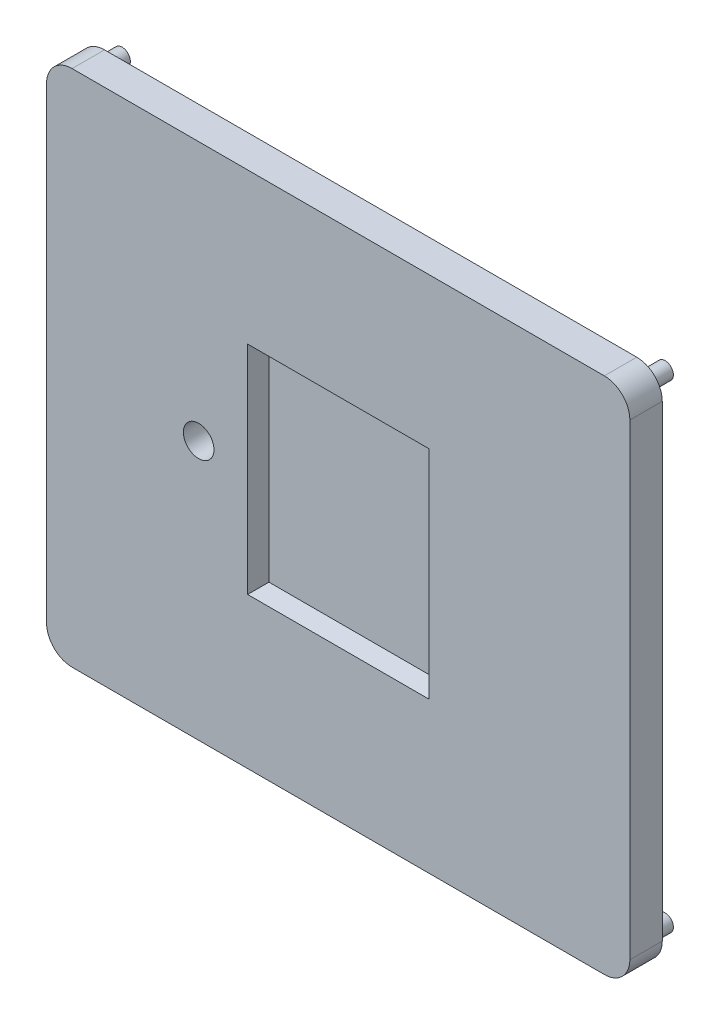
ISO-10303-21;
HEADER;
FILE_DESCRIPTION(('STEP AP214'),'2;1');
FILE_NAME('part.step','',(''),(''),'','','');
FILE_SCHEMA(('AUTOMOTIVE_DESIGN { 1 0 10303 214 1 1 1 1 }'));
ENDSEC;
DATA;
#1=APPLICATION_CONTEXT('core data for automotive mechanical design processes');
#2=APPLICATION_PROTOCOL_DEFINITION('international standard','automotive_design',2000,#1);
#3=PRODUCT_CONTEXT('',#1,'mechanical');
#4=PRODUCT('Part','Part','',(#3));
#5=PRODUCT_RELATED_PRODUCT_CATEGORY('part','',(#4));
#6=PRODUCT_DEFINITION_FORMATION('','',#4);
#7=PRODUCT_DEFINITION_CONTEXT('part definition',#1,'design');
#8=PRODUCT_DEFINITION('design','',#6,#7);
#9=PRODUCT_DEFINITION_SHAPE('','',#8);
#10=(LENGTH_UNIT() NAMED_UNIT(*) SI_UNIT(.MILLI.,.METRE.));
#11=(NAMED_UNIT(*) PLANE_ANGLE_UNIT() SI_UNIT($,.RADIAN.));
#12=(NAMED_UNIT(*) SI_UNIT($,.STERADIAN.) SOLID_ANGLE_UNIT());
#13=UNCERTAINTY_MEASURE_WITH_UNIT(LENGTH_MEASURE(1.E-05),#10,'distance_accuracy_value','');
#14=(GEOMETRIC_REPRESENTATION_CONTEXT(3) GLOBAL_UNCERTAINTY_ASSIGNED_CONTEXT((#13)) GLOBAL_UNIT_ASSIGNED_CONTEXT((#10,
#11,#12)) REPRESENTATION_CONTEXT('',''));
#15=CARTESIAN_POINT('',(0.,0.,0.));
#16=DIRECTION('',(0.,0.,1.));
#17=DIRECTION('',(1.,0.,0.));
#18=AXIS2_PLACEMENT_3D('',#15,#16,#17);
#19=CARTESIAN_POINT('',(-148.169682961673,72.4468468468469,12.7));
#20=DIRECTION('',(0.,0.,-1.));
#21=DIRECTION('',(-1.,0.,0.));
#22=AXIS2_PLACEMENT_3D('',#19,#20,#21);
#23=CYLINDRICAL_SURFACE('',#22,10.);
#24=CARTESIAN_POINT('',(-148.169682961673,72.4468468468469,0.));
#25=DIRECTION('',(0.,0.,1.));
#26=DIRECTION('',(1.,0.,0.));
#27=AXIS2_PLACEMENT_3D('',#24,#25,#26);
#28=CIRCLE('',#27,10.);
#29=CARTESIAN_POINT('',(-148.169682961673,82.4468468468469,0.));
#30=VERTEX_POINT('',#29);
#31=CARTESIAN_POINT('',(-158.169682961673,72.4468468468468,0.));
#32=VERTEX_POINT('',#31);
#33=EDGE_CURVE('E222',#30,#32,#28,.T.);
#34=ORIENTED_EDGE('',*,*,#33,.T.);
#35=DIRECTION('',(0.,0.,-1.));
#36=VECTOR('',#35,1.);
#37=CARTESIAN_POINT('',(-158.169682961673,72.4468468468468,12.7));
#38=LINE('',#37,#36);
#39=CARTESIAN_POINT('',(-158.169682961673,72.4468468468468,12.7));
#40=VERTEX_POINT('',#39);
#41=EDGE_CURVE('E12',#40,#32,#38,.T.);
#42=ORIENTED_EDGE('',*,*,#41,.F.);
#43=CARTESIAN_POINT('',(-148.169682961673,72.4468468468469,12.7));
#44=DIRECTION('',(0.,0.,1.));
#45=DIRECTION('',(1.,0.,0.));
#46=AXIS2_PLACEMENT_3D('',#43,#44,#45);
#47=CIRCLE('',#46,10.);
#48=CARTESIAN_POINT('',(-148.169682961673,82.4468468468469,12.7));
#49=VERTEX_POINT('',#48);
#50=EDGE_CURVE('E209',#49,#40,#47,.T.);
#51=ORIENTED_EDGE('',*,*,#50,.F.);
#52=DIRECTION('',(0.,0.,-1.));
#53=VECTOR('',#52,1.);
#54=CARTESIAN_POINT('',(-148.169682961673,82.4468468468469,12.7));
#55=LINE('',#54,#53);
#56=EDGE_CURVE('E203',#49,#30,#55,.T.);
#57=ORIENTED_EDGE('',*,*,#56,.T.);
#58=EDGE_LOOP('',(#34,#42,#51,#57));
#59=FACE_BOUND('',#58,.T.);
#60=ADVANCED_FACE('F45',(#59),#23,.T.);
#61=CARTESIAN_POINT('',(-158.169682961673,72.4468468468468,12.7));
#62=DIRECTION('',(1.,0.,0.));
#63=DIRECTION('',(0.,0.,-1.));
#64=AXIS2_PLACEMENT_3D('',#61,#62,#63);
#65=PLANE('',#64);
#66=DIRECTION('',(0.,-1.,0.));
#67=VECTOR('',#66,1.);
#68=CARTESIAN_POINT('',(-158.169682961673,72.4468468468468,0.));
#69=LINE('',#68,#67);
#70=CARTESIAN_POINT('',(-158.169682961673,-110.753153153153,0.));
#71=VERTEX_POINT('',#70);
#72=EDGE_CURVE('E220',#32,#71,#69,.T.);
#73=ORIENTED_EDGE('',*,*,#72,.T.);
#74=DIRECTION('',(0.,0.,-1.));
#75=VECTOR('',#74,1.);
#76=CARTESIAN_POINT('',(-158.169682961673,-110.753153153153,12.7));
#77=LINE('',#76,#75);
#78=CARTESIAN_POINT('',(-158.169682961673,-110.753153153153,12.7));
#79=VERTEX_POINT('',#78);
#80=EDGE_CURVE('E53',#79,#71,#77,.T.);
#81=ORIENTED_EDGE('',*,*,#80,.F.);
#82=DIRECTION('',(0.,-1.,0.));
#83=VECTOR('',#82,1.);
#84=CARTESIAN_POINT('',(-158.169682961673,72.4468468468468,12.7));
#85=LINE('',#84,#83);
#86=EDGE_CURVE('E237',#40,#79,#85,.T.);
#87=ORIENTED_EDGE('',*,*,#86,.F.);
#88=ORIENTED_EDGE('',*,*,#41,.T.);
#89=EDGE_LOOP('',(#73,#81,#87,#88));
#90=FACE_BOUND('',#89,.T.);
#91=ADVANCED_FACE('F396',(#90),#65,.F.);
#92=CARTESIAN_POINT('',(-148.169682961673,-110.753153153153,12.7));
#93=DIRECTION('',(0.,0.,-1.));
#94=DIRECTION('',(-1.,0.,0.));
#95=AXIS2_PLACEMENT_3D('',#92,#93,#94);
#96=CYLINDRICAL_SURFACE('',#95,10.);
#97=CARTESIAN_POINT('',(-148.169682961673,-110.753153153153,0.));
#98=DIRECTION('',(0.,0.,1.));
#99=DIRECTION('',(1.,0.,0.));
#100=AXIS2_PLACEMENT_3D('',#97,#98,#99);
#101=CIRCLE('',#100,10.);
#102=CARTESIAN_POINT('',(-148.169682961673,-120.753153153153,0.));
#103=VERTEX_POINT('',#102);
#104=EDGE_CURVE('E218',#71,#103,#101,.T.);
#105=ORIENTED_EDGE('',*,*,#104,.T.);
#106=DIRECTION('',(0.,0.,-1.));
#107=VECTOR('',#106,1.);
#108=CARTESIAN_POINT('',(-148.169682961673,-120.753153153153,12.7));
#109=LINE('',#108,#107);
#110=CARTESIAN_POINT('',(-148.169682961673,-120.753153153153,12.7));
#111=VERTEX_POINT('',#110);
#112=EDGE_CURVE('E188',#111,#103,#109,.T.);
#113=ORIENTED_EDGE('',*,*,#112,.F.);
#114=CARTESIAN_POINT('',(-148.169682961673,-110.753153153153,12.7));
#115=DIRECTION('',(0.,0.,1.));
#116=DIRECTION('',(1.,0.,0.));
#117=AXIS2_PLACEMENT_3D('',#114,#115,#116);
#118=CIRCLE('',#117,10.);
#119=EDGE_CURVE('E235',#79,#111,#118,.T.);
#120=ORIENTED_EDGE('',*,*,#119,.F.);
#121=ORIENTED_EDGE('',*,*,#80,.T.);
#122=EDGE_LOOP('',(#105,#113,#120,#121));
#123=FACE_BOUND('',#122,.T.);
#124=ADVANCED_FACE('F401',(#123),#96,.T.);
#125=CARTESIAN_POINT('',(-148.169682961673,-120.753153153153,12.7));
#126=DIRECTION('',(0.,1.,0.));
#127=DIRECTION('',(0.,0.,1.));
#128=AXIS2_PLACEMENT_3D('',#125,#126,#127);
#129=PLANE('',#128);
#130=DIRECTION('',(1.,0.,0.));
#131=VECTOR('',#130,1.);
#132=CARTESIAN_POINT('',(-148.169682961673,-120.753153153153,0.));
#133=LINE('',#132,#131);
#134=CARTESIAN_POINT('',(60.4303170383271,-120.753153153153,0.));
#135=VERTEX_POINT('',#134);
#136=EDGE_CURVE('E216',#103,#135,#133,.T.);
#137=ORIENTED_EDGE('',*,*,#136,.T.);
#138=DIRECTION('',(0.,0.,-1.));
#139=VECTOR('',#138,1.);
#140=CARTESIAN_POINT('',(60.4303170383271,-120.753153153153,12.7));
#141=LINE('',#140,#139);
#142=CARTESIAN_POINT('',(60.4303170383271,-120.753153153153,12.7));
#143=VERTEX_POINT('',#142);
#144=EDGE_CURVE('E191',#143,#135,#141,.T.);
#145=ORIENTED_EDGE('',*,*,#144,.F.);
#146=DIRECTION('',(1.,0.,0.));
#147=VECTOR('',#146,1.);
#148=CARTESIAN_POINT('',(-148.169682961673,-120.753153153153,12.7));
#149=LINE('',#148,#147);
#150=EDGE_CURVE('E233',#111,#143,#149,.T.);
#151=ORIENTED_EDGE('',*,*,#150,.F.);
#152=ORIENTED_EDGE('',*,*,#112,.T.);
#153=EDGE_LOOP('',(#137,#145,#151,#152));
#154=FACE_BOUND('',#153,.T.);
#155=ADVANCED_FACE('F434',(#154),#129,.F.);
#156=CARTESIAN_POINT('',(60.4303170383271,-110.753153153153,12.7));
#157=DIRECTION('',(0.,0.,-1.));
#158=DIRECTION('',(-1.,0.,0.));
#159=AXIS2_PLACEMENT_3D('',#156,#157,#158);
#160=CYLINDRICAL_SURFACE('',#159,9.99999999999999);
#161=CARTESIAN_POINT('',(60.4303170383271,-110.753153153153,0.));
#162=DIRECTION('',(0.,0.,1.));
#163=DIRECTION('',(1.,0.,0.));
#164=AXIS2_PLACEMENT_3D('',#161,#162,#163);
#165=CIRCLE('',#164,9.99999999999999);
#166=CARTESIAN_POINT('',(70.4303170383271,-110.753153153153,0.));
#167=VERTEX_POINT('',#166);
#168=EDGE_CURVE('E214',#135,#167,#165,.T.);
#169=ORIENTED_EDGE('',*,*,#168,.T.);
#170=DIRECTION('',(0.,0.,-1.));
#171=VECTOR('',#170,1.);
#172=CARTESIAN_POINT('',(70.4303170383271,-110.753153153153,12.7));
#173=LINE('',#172,#171);
#174=CARTESIAN_POINT('',(70.4303170383271,-110.753153153153,12.7));
#175=VERTEX_POINT('',#174);
#176=EDGE_CURVE('E194',#175,#167,#173,.T.);
#177=ORIENTED_EDGE('',*,*,#176,.F.);
#178=CARTESIAN_POINT('',(60.4303170383271,-110.753153153153,12.7));
#179=DIRECTION('',(0.,0.,1.));
#180=DIRECTION('',(1.,0.,0.));
#181=AXIS2_PLACEMENT_3D('',#178,#179,#180);
#182=CIRCLE('',#181,9.99999999999999);
#183=EDGE_CURVE('E231',#143,#175,#182,.T.);
#184=ORIENTED_EDGE('',*,*,#183,.F.);
#185=ORIENTED_EDGE('',*,*,#144,.T.);
#186=EDGE_LOOP('',(#169,#177,#184,#185));
#187=FACE_BOUND('',#186,.T.);
#188=ADVANCED_FACE('F430',(#187),#160,.T.);
#189=CARTESIAN_POINT('',(70.4303170383271,72.4468468468469,12.7));
#190=DIRECTION('',(-1.,0.,0.));
#191=DIRECTION('',(0.,-1.,0.));
#192=AXIS2_PLACEMENT_3D('',#189,#190,#191);
#193=PLANE('',#192);
#194=DIRECTION('',(0.,1.,0.));
#195=VECTOR('',#194,1.);
#196=CARTESIAN_POINT('',(70.4303170383271,72.4468468468469,0.));
#197=LINE('',#196,#195);
#198=CARTESIAN_POINT('',(70.4303170383271,72.4468468468469,0.));
#199=VERTEX_POINT('',#198);
#200=EDGE_CURVE('E212',#167,#199,#197,.T.);
#201=ORIENTED_EDGE('',*,*,#200,.T.);
#202=DIRECTION('',(0.,0.,-1.));
#203=VECTOR('',#202,1.);
#204=CARTESIAN_POINT('',(70.4303170383271,72.4468468468469,12.7));
#205=LINE('',#204,#203);
#206=CARTESIAN_POINT('',(70.4303170383271,72.4468468468469,12.7));
#207=VERTEX_POINT('',#206);
#208=EDGE_CURVE('E197',#207,#199,#205,.T.);
#209=ORIENTED_EDGE('',*,*,#208,.F.);
#210=DIRECTION('',(0.,1.,0.));
#211=VECTOR('',#210,1.);
#212=CARTESIAN_POINT('',(70.4303170383271,72.4468468468469,12.7));
#213=LINE('',#212,#211);
#214=EDGE_CURVE('E229',#175,#207,#213,.T.);
#215=ORIENTED_EDGE('',*,*,#214,.F.);
#216=ORIENTED_EDGE('',*,*,#176,.T.);
#217=EDGE_LOOP('',(#201,#209,#215,#216));
#218=FACE_BOUND('',#217,.T.);
#219=ADVANCED_FACE('F425',(#218),#193,.F.);
#220=CARTESIAN_POINT('',(60.4303170383271,72.4468468468469,12.7));
#221=DIRECTION('',(0.,0.,-1.));
#222=DIRECTION('',(-1.,0.,0.));
#223=AXIS2_PLACEMENT_3D('',#220,#221,#222);
#224=CYLINDRICAL_SURFACE('',#223,9.99999999999999);
#225=CARTESIAN_POINT('',(60.4303170383271,72.4468468468469,0.));
#226=DIRECTION('',(0.,0.,1.));
#227=DIRECTION('',(-1.,0.,0.));
#228=AXIS2_PLACEMENT_3D('',#225,#226,#227);
#229=CIRCLE('',#228,9.99999999999999);
#230=CARTESIAN_POINT('',(60.4303170383271,82.4468468468468,0.));
#231=VERTEX_POINT('',#230);
#232=EDGE_CURVE('E210',#199,#231,#229,.T.);
#233=ORIENTED_EDGE('',*,*,#232,.T.);
#234=DIRECTION('',(0.,0.,-1.));
#235=VECTOR('',#234,1.);
#236=CARTESIAN_POINT('',(60.4303170383271,82.4468468468468,12.7));
#237=LINE('',#236,#235);
#238=CARTESIAN_POINT('',(60.4303170383271,82.4468468468468,12.7));
#239=VERTEX_POINT('',#238);
#240=EDGE_CURVE('E200',#239,#231,#237,.T.);
#241=ORIENTED_EDGE('',*,*,#240,.F.);
#242=CARTESIAN_POINT('',(60.4303170383271,72.4468468468469,12.7));
#243=DIRECTION('',(0.,0.,1.));
#244=DIRECTION('',(-1.,0.,0.));
#245=AXIS2_PLACEMENT_3D('',#242,#243,#244);
#246=CIRCLE('',#245,9.99999999999999);
#247=EDGE_CURVE('E227',#207,#239,#246,.T.);
#248=ORIENTED_EDGE('',*,*,#247,.F.);
#249=ORIENTED_EDGE('',*,*,#208,.T.);
#250=EDGE_LOOP('',(#233,#241,#248,#249));
#251=FACE_BOUND('',#250,.T.);
#252=ADVANCED_FACE('F420',(#251),#224,.T.);
#253=CARTESIAN_POINT('',(-148.169682961673,82.4468468468469,12.7));
#254=DIRECTION('',(0.,-1.,0.));
#255=DIRECTION('',(1.,0.,0.));
#256=AXIS2_PLACEMENT_3D('',#253,#254,#255);
#257=PLANE('',#256);
#258=DIRECTION('',(-1.,0.,0.));
#259=VECTOR('',#258,1.);
#260=CARTESIAN_POINT('',(-148.169682961673,82.4468468468469,0.));
#261=LINE('',#260,#259);
#262=EDGE_CURVE('E207',#231,#30,#261,.T.);
#263=ORIENTED_EDGE('',*,*,#262,.T.);
#264=ORIENTED_EDGE('',*,*,#56,.F.);
#265=DIRECTION('',(-1.,0.,0.));
#266=VECTOR('',#265,1.);
#267=CARTESIAN_POINT('',(-148.169682961673,82.4468468468469,12.7));
#268=LINE('',#267,#266);
#269=EDGE_CURVE('E206',#239,#49,#268,.T.);
#270=ORIENTED_EDGE('',*,*,#269,.F.);
#271=ORIENTED_EDGE('',*,*,#240,.T.);
#272=EDGE_LOOP('',(#263,#264,#270,#271));
#273=FACE_BOUND('',#272,.T.);
#274=ADVANCED_FACE('F418',(#273),#257,.F.);
#275=CARTESIAN_POINT('',(-148.169682961673,72.4468468468469,12.7));
#276=DIRECTION('',(0.,0.,1.));
#277=DIRECTION('',(1.,0.,0.));
#278=AXIS2_PLACEMENT_3D('',#275,#276,#277);
#279=PLANE('',#278);
#280=CARTESIAN_POINT('',(-98.5666408145533,-19.1531531531531,12.7));
#281=DIRECTION('',(0.,0.,1.));
#282=DIRECTION('',(1.,0.,0.));
#283=AXIS2_PLACEMENT_3D('',#280,#281,#282);
#284=CIRCLE('',#283,6.);
#285=CARTESIAN_POINT('',(-92.5666408145533,-19.1531531531531,12.7));
#286=VERTEX_POINT('',#285);
#287=EDGE_CURVE('E380',#286,#286,#284,.T.);
#288=ORIENTED_EDGE('',*,*,#287,.F.);
#289=EDGE_LOOP('',(#288));
#290=FACE_BOUND('',#289,.T.);
#291=DIRECTION('',(-1.,0.,0.));
#292=VECTOR('',#291,1.);
#293=CARTESIAN_POINT('',(-8.36968296167288,23.3468468468469,12.7));
#294=LINE('',#293,#292);
#295=CARTESIAN_POINT('',(-8.36968296167288,23.3468468468469,12.7));
#296=VERTEX_POINT('',#295);
#297=CARTESIAN_POINT('',(-79.3696829616729,23.3468468468469,12.7));
#298=VERTEX_POINT('',#297);
#299=EDGE_CURVE('E151',#296,#298,#294,.T.);
#300=ORIENTED_EDGE('',*,*,#299,.F.);
#301=DIRECTION('',(0.,1.,0.));
#302=VECTOR('',#301,1.);
#303=CARTESIAN_POINT('',(-8.36968296167288,23.3468468468469,12.7));
#304=LINE('',#303,#302);
#305=CARTESIAN_POINT('',(-8.36968296167287,-61.6531531531532,12.7));
#306=VERTEX_POINT('',#305);
#307=EDGE_CURVE('E163',#306,#296,#304,.T.);
#308=ORIENTED_EDGE('',*,*,#307,.F.);
#309=DIRECTION('',(1.,0.,0.));
#310=VECTOR('',#309,1.);
#311=CARTESIAN_POINT('',(-8.36968296167287,-61.6531531531532,12.7));
#312=LINE('',#311,#310);
#313=CARTESIAN_POINT('',(-79.3696829616729,-61.6531531531532,12.7));
#314=VERTEX_POINT('',#313);
#315=EDGE_CURVE('E169',#314,#306,#312,.T.);
#316=ORIENTED_EDGE('',*,*,#315,.F.);
#317=DIRECTION('',(0.,-1.,0.));
#318=VECTOR('',#317,1.);
#319=CARTESIAN_POINT('',(-79.3696829616729,23.3468468468469,12.7));
#320=LINE('',#319,#318);
#321=EDGE_CURVE('E174',#298,#314,#320,.T.);
#322=ORIENTED_EDGE('',*,*,#321,.F.);
#323=EDGE_LOOP('',(#300,#308,#316,#322));
#324=FACE_BOUND('',#323,.T.);
#325=ORIENTED_EDGE('',*,*,#50,.T.);
#326=ORIENTED_EDGE('',*,*,#86,.T.);
#327=ORIENTED_EDGE('',*,*,#119,.T.);
#328=ORIENTED_EDGE('',*,*,#150,.T.);
#329=ORIENTED_EDGE('',*,*,#183,.T.);
#330=ORIENTED_EDGE('',*,*,#214,.T.);
#331=ORIENTED_EDGE('',*,*,#247,.T.);
#332=ORIENTED_EDGE('',*,*,#269,.T.);
#333=EDGE_LOOP('',(#325,#326,#327,#328,#329,#330,#331,#332));
#334=FACE_BOUND('',#333,.T.);
#335=ADVANCED_FACE('F172',(#290,#324,#334),#279,.T.);
#336=CARTESIAN_POINT('',(-148.169682961673,72.4468468468469,0.));
#337=DIRECTION('',(0.,0.,1.));
#338=DIRECTION('',(1.,0.,0.));
#339=AXIS2_PLACEMENT_3D('',#336,#337,#338);
#340=PLANE('',#339);
#341=CARTESIAN_POINT('',(-98.5666408145533,-19.1531531531531,0.));
#342=DIRECTION('',(0.,0.,1.));
#343=DIRECTION('',(1.,0.,0.));
#344=AXIS2_PLACEMENT_3D('',#341,#342,#343);
#345=CIRCLE('',#344,6.);
#346=CARTESIAN_POINT('',(-92.5666408145533,-19.1531531531531,0.));
#347=VERTEX_POINT('',#346);
#348=EDGE_CURVE('E48',#347,#347,#345,.T.);
#349=ORIENTED_EDGE('',*,*,#348,.T.);
#350=EDGE_LOOP('',(#349));
#351=FACE_BOUND('',#350,.T.);
#352=CARTESIAN_POINT('',(-150.291003305233,74.5681671904065,0.));
#353=DIRECTION('',(0.,0.,1.));
#354=DIRECTION('',(1.,0.,0.));
#355=AXIS2_PLACEMENT_3D('',#352,#353,#354);
#356=CIRCLE('',#355,3.24999999999993);
#357=CARTESIAN_POINT('',(-147.041003305233,74.5681671904065,0.));
#358=VERTEX_POINT('',#357);
#359=EDGE_CURVE('E267',#358,#358,#356,.T.);
#360=ORIENTED_EDGE('',*,*,#359,.T.);
#361=EDGE_LOOP('',(#360));
#362=FACE_BOUND('',#361,.T.);
#363=CARTESIAN_POINT('',(-150.291003305233,-112.874473496713,0.));
#364=DIRECTION('',(0.,0.,1.));
#365=DIRECTION('',(1.,0.,0.));
#366=AXIS2_PLACEMENT_3D('',#363,#364,#365);
#367=CIRCLE('',#366,3.25000000000001);
#368=CARTESIAN_POINT('',(-147.041003305233,-112.874473496713,0.));
#369=VERTEX_POINT('',#368);
#370=EDGE_CURVE('E261',#369,#369,#367,.T.);
#371=ORIENTED_EDGE('',*,*,#370,.T.);
#372=EDGE_LOOP('',(#371));
#373=FACE_BOUND('',#372,.T.);
#374=CARTESIAN_POINT('',(62.5516373818868,-112.874473496713,0.));
#375=DIRECTION('',(0.,0.,1.));
#376=DIRECTION('',(1.,0.,0.));
#377=AXIS2_PLACEMENT_3D('',#374,#375,#376);
#378=CIRCLE('',#377,3.24999999999996);
#379=CARTESIAN_POINT('',(64.8497344207431,-115.172570535569,0.));
#380=VERTEX_POINT('',#379);
#381=CARTESIAN_POINT('',(60.2535403430305,-110.576376457857,0.));
#382=VERTEX_POINT('',#381);
#383=EDGE_CURVE('E251',#380,#382,#378,.T.);
#384=ORIENTED_EDGE('',*,*,#383,.T.);
#385=DIRECTION('',(0.707106781186548,-0.707106781186547,0.));
#386=VECTOR('',#385,1.);
#387=CARTESIAN_POINT('',(-25.1614180574131,-25.1614180574131,0.));
#388=LINE('',#387,#386);
#389=EDGE_CURVE('E69',#382,#380,#388,.T.);
#390=ORIENTED_EDGE('',*,*,#389,.T.);
#391=EDGE_LOOP('',(#384,#390));
#392=FACE_BOUND('',#391,.T.);
#393=CARTESIAN_POINT('',(62.5516373818867,74.5681671904065,0.));
#394=DIRECTION('',(0.,0.,1.));
#395=DIRECTION('',(1.,0.,0.));
#396=AXIS2_PLACEMENT_3D('',#393,#394,#395);
#397=CIRCLE('',#396,3.24999999999999);
#398=CARTESIAN_POINT('',(65.8016373818867,74.5681671904065,0.));
#399=VERTEX_POINT('',#398);
#400=EDGE_CURVE('E241',#399,#399,#397,.T.);
#401=ORIENTED_EDGE('',*,*,#400,.T.);
#402=EDGE_LOOP('',(#401));
#403=FACE_BOUND('',#402,.T.);
#404=ORIENTED_EDGE('',*,*,#33,.F.);
#405=ORIENTED_EDGE('',*,*,#262,.F.);
#406=ORIENTED_EDGE('',*,*,#232,.F.);
#407=ORIENTED_EDGE('',*,*,#200,.F.);
#408=ORIENTED_EDGE('',*,*,#168,.F.);
#409=ORIENTED_EDGE('',*,*,#136,.F.);
#410=ORIENTED_EDGE('',*,*,#104,.F.);
#411=ORIENTED_EDGE('',*,*,#72,.F.);
#412=EDGE_LOOP('',(#404,#405,#406,#407,#408,#409,#410,#411));
#413=FACE_BOUND('',#412,.T.);
#414=ADVANCED_FACE('F387',(#351,#362,#373,#392,#403,#413),#340,.F.);
#415=CARTESIAN_POINT('',(62.5516373818867,74.5681671904065,-9.));
#416=DIRECTION('',(0.,0.,1.));
#417=DIRECTION('',(1.,0.,0.));
#418=AXIS2_PLACEMENT_3D('',#415,#416,#417);
#419=CYLINDRICAL_SURFACE('',#418,3.24999999999999);
#420=CARTESIAN_POINT('',(62.5516373818867,74.5681671904065,-9.));
#421=DIRECTION('',(0.,0.,1.));
#422=DIRECTION('',(1.,0.,0.));
#423=AXIS2_PLACEMENT_3D('',#420,#421,#422);
#424=CIRCLE('',#423,3.24999999999999);
#425=CARTESIAN_POINT('',(65.8016373818867,74.5681671904065,-9.));
#426=VERTEX_POINT('',#425);
#427=EDGE_CURVE('E225',#426,#426,#424,.T.);
#428=ORIENTED_EDGE('',*,*,#427,.T.);
#429=EDGE_LOOP('',(#428));
#430=FACE_BOUND('',#429,.T.);
#431=ORIENTED_EDGE('',*,*,#400,.F.);
#432=EDGE_LOOP('',(#431));
#433=FACE_BOUND('',#432,.T.);
#434=ADVANCED_FACE('F454',(#430,#433),#419,.T.);
#435=CARTESIAN_POINT('',(0.,0.,-9.));
#436=DIRECTION('',(0.,0.,1.));
#437=DIRECTION('',(1.,0.,0.));
#438=AXIS2_PLACEMENT_3D('',#435,#436,#437);
#439=PLANE('',#438);
#440=ORIENTED_EDGE('',*,*,#427,.F.);
#441=EDGE_LOOP('',(#440));
#442=FACE_BOUND('',#441,.T.);
#443=ADVANCED_FACE('F460',(#442),#439,.F.);
#444=CARTESIAN_POINT('',(-25.1614180574131,-25.1614180574131,-9.));
#445=DIRECTION('',(-0.707106781186547,-0.707106781186548,0.));
#446=DIRECTION('',(0.707106781186548,-0.707106781186547,0.));
#447=AXIS2_PLACEMENT_3D('',#444,#445,#446);
#448=PLANE('',#447);
#449=ORIENTED_EDGE('',*,*,#389,.F.);
#450=DIRECTION('',(0.,0.,1.));
#451=VECTOR('',#450,1.);
#452=CARTESIAN_POINT('',(60.2535403430305,-110.576376457857,-9.));
#453=LINE('',#452,#451);
#454=CARTESIAN_POINT('',(60.2535403430305,-110.576376457857,-9.));
#455=VERTEX_POINT('',#454);
#456=EDGE_CURVE('E244',#455,#382,#453,.T.);
#457=ORIENTED_EDGE('',*,*,#456,.F.);
#458=DIRECTION('',(0.707106781186548,-0.707106781186547,0.));
#459=VECTOR('',#458,1.);
#460=CARTESIAN_POINT('',(-25.1614180574131,-25.1614180574131,-9.));
#461=LINE('',#460,#459);
#462=CARTESIAN_POINT('',(64.8497344207431,-115.172570535569,-9.));
#463=VERTEX_POINT('',#462);
#464=EDGE_CURVE('E254',#455,#463,#461,.T.);
#465=ORIENTED_EDGE('',*,*,#464,.T.);
#466=DIRECTION('',(0.,0.,1.));
#467=VECTOR('',#466,1.);
#468=CARTESIAN_POINT('',(64.8497344207431,-115.172570535569,-9.));
#469=LINE('',#468,#467);
#470=EDGE_CURVE('E247',#463,#380,#469,.T.);
#471=ORIENTED_EDGE('',*,*,#470,.T.);
#472=EDGE_LOOP('',(#449,#457,#465,#471));
#473=FACE_BOUND('',#472,.T.);
#474=ADVANCED_FACE('F464',(#473),#448,.T.);
#475=CARTESIAN_POINT('',(62.5516373818868,-112.874473496713,-9.));
#476=DIRECTION('',(0.,0.,1.));
#477=DIRECTION('',(1.,0.,0.));
#478=AXIS2_PLACEMENT_3D('',#475,#476,#477);
#479=CYLINDRICAL_SURFACE('',#478,3.24999999999996);
#480=ORIENTED_EDGE('',*,*,#383,.F.);
#481=ORIENTED_EDGE('',*,*,#470,.F.);
#482=CARTESIAN_POINT('',(62.5516373818868,-112.874473496713,-9.));
#483=DIRECTION('',(0.,0.,1.));
#484=DIRECTION('',(1.,0.,0.));
#485=AXIS2_PLACEMENT_3D('',#482,#483,#484);
#486=CIRCLE('',#485,3.24999999999996);
#487=EDGE_CURVE('E249',#463,#455,#486,.T.);
#488=ORIENTED_EDGE('',*,*,#487,.T.);
#489=ORIENTED_EDGE('',*,*,#456,.T.);
#490=EDGE_LOOP('',(#480,#481,#488,#489));
#491=FACE_BOUND('',#490,.T.);
#492=ADVANCED_FACE('F468',(#491),#479,.T.);
#493=CARTESIAN_POINT('',(0.,0.,-9.));
#494=DIRECTION('',(0.,0.,1.));
#495=DIRECTION('',(1.,0.,0.));
#496=AXIS2_PLACEMENT_3D('',#493,#494,#495);
#497=PLANE('',#496);
#498=ORIENTED_EDGE('',*,*,#464,.F.);
#499=ORIENTED_EDGE('',*,*,#487,.F.);
#500=EDGE_LOOP('',(#498,#499));
#501=FACE_BOUND('',#500,.T.);
#502=ADVANCED_FACE('F471',(#501),#497,.F.);
#503=CARTESIAN_POINT('',(-150.291003305233,-112.874473496713,-9.));
#504=DIRECTION('',(0.,0.,1.));
#505=DIRECTION('',(1.,0.,0.));
#506=AXIS2_PLACEMENT_3D('',#503,#504,#505);
#507=CYLINDRICAL_SURFACE('',#506,3.25000000000001);
#508=CARTESIAN_POINT('',(-150.291003305233,-112.874473496713,-9.));
#509=DIRECTION('',(0.,0.,1.));
#510=DIRECTION('',(1.,0.,0.));
#511=AXIS2_PLACEMENT_3D('',#508,#509,#510);
#512=CIRCLE('',#511,3.25000000000001);
#513=CARTESIAN_POINT('',(-147.041003305233,-112.874473496713,-9.));
#514=VERTEX_POINT('',#513);
#515=EDGE_CURVE('E256',#514,#514,#512,.T.);
#516=ORIENTED_EDGE('',*,*,#515,.T.);
#517=EDGE_LOOP('',(#516));
#518=FACE_BOUND('',#517,.T.);
#519=ORIENTED_EDGE('',*,*,#370,.F.);
#520=EDGE_LOOP('',(#519));
#521=FACE_BOUND('',#520,.T.);
#522=ADVANCED_FACE('F475',(#518,#521),#507,.T.);
#523=CARTESIAN_POINT('',(0.,0.,-9.));
#524=DIRECTION('',(0.,0.,1.));
#525=DIRECTION('',(1.,0.,0.));
#526=AXIS2_PLACEMENT_3D('',#523,#524,#525);
#527=PLANE('',#526);
#528=ORIENTED_EDGE('',*,*,#515,.F.);
#529=EDGE_LOOP('',(#528));
#530=FACE_BOUND('',#529,.T.);
#531=ADVANCED_FACE('F479',(#530),#527,.F.);
#532=CARTESIAN_POINT('',(-150.291003305233,74.5681671904065,-9.));
#533=DIRECTION('',(0.,0.,1.));
#534=DIRECTION('',(1.,0.,0.));
#535=AXIS2_PLACEMENT_3D('',#532,#533,#534);
#536=CYLINDRICAL_SURFACE('',#535,3.24999999999993);
#537=CARTESIAN_POINT('',(-150.291003305233,74.5681671904065,-9.));
#538=DIRECTION('',(0.,0.,1.));
#539=DIRECTION('',(1.,0.,0.));
#540=AXIS2_PLACEMENT_3D('',#537,#538,#539);
#541=CIRCLE('',#540,3.24999999999993);
#542=CARTESIAN_POINT('',(-147.041003305233,74.5681671904065,-9.));
#543=VERTEX_POINT('',#542);
#544=EDGE_CURVE('E264',#543,#543,#541,.T.);
#545=ORIENTED_EDGE('',*,*,#544,.T.);
#546=EDGE_LOOP('',(#545));
#547=FACE_BOUND('',#546,.T.);
#548=ORIENTED_EDGE('',*,*,#359,.F.);
#549=EDGE_LOOP('',(#548));
#550=FACE_BOUND('',#549,.T.);
#551=ADVANCED_FACE('F482',(#547,#550),#536,.T.);
#552=CARTESIAN_POINT('',(0.,0.,-9.));
#553=DIRECTION('',(0.,0.,1.));
#554=DIRECTION('',(1.,0.,0.));
#555=AXIS2_PLACEMENT_3D('',#552,#553,#554);
#556=PLANE('',#555);
#557=ORIENTED_EDGE('',*,*,#544,.F.);
#558=EDGE_LOOP('',(#557));
#559=FACE_BOUND('',#558,.T.);
#560=ADVANCED_FACE('F287',(#559),#556,.F.);
#561=CARTESIAN_POINT('',(0.,0.,6.35));
#562=DIRECTION('',(0.,0.,-1.));
#563=DIRECTION('',(-1.,0.,0.));
#564=AXIS2_PLACEMENT_3D('',#561,#562,#563);
#565=PLANE('',#564);
#566=DIRECTION('',(0.,1.,0.));
#567=VECTOR('',#566,1.);
#568=CARTESIAN_POINT('',(-10.3696829616729,21.3468468468469,6.35));
#569=LINE('',#568,#567);
#570=CARTESIAN_POINT('',(-10.3696829616729,-59.6531531531532,6.35));
#571=VERTEX_POINT('',#570);
#572=CARTESIAN_POINT('',(-10.3696829616729,21.3468468468469,6.35));
#573=VERTEX_POINT('',#572);
#574=EDGE_CURVE('E318',#571,#573,#569,.T.);
#575=ORIENTED_EDGE('',*,*,#574,.T.);
#576=DIRECTION('',(-1.,0.,0.));
#577=VECTOR('',#576,1.);
#578=CARTESIAN_POINT('',(-10.3696829616729,21.3468468468469,6.35));
#579=LINE('',#578,#577);
#580=CARTESIAN_POINT('',(-77.3696829616729,21.3468468468468,6.35));
#581=VERTEX_POINT('',#580);
#582=EDGE_CURVE('E154',#573,#581,#579,.T.);
#583=ORIENTED_EDGE('',*,*,#582,.T.);
#584=DIRECTION('',(0.,-1.,0.));
#585=VECTOR('',#584,1.);
#586=CARTESIAN_POINT('',(-77.3696829616729,21.3468468468468,6.35));
#587=LINE('',#586,#585);
#588=CARTESIAN_POINT('',(-77.3696829616729,-59.6531531531532,6.35));
#589=VERTEX_POINT('',#588);
#590=EDGE_CURVE('E317',#581,#589,#587,.T.);
#591=ORIENTED_EDGE('',*,*,#590,.T.);
#592=DIRECTION('',(1.,0.,0.));
#593=VECTOR('',#592,1.);
#594=CARTESIAN_POINT('',(-10.3696829616729,-59.6531531531532,6.35));
#595=LINE('',#594,#593);
#596=EDGE_CURVE('E311',#589,#571,#595,.T.);
#597=ORIENTED_EDGE('',*,*,#596,.T.);
#598=EDGE_LOOP('',(#575,#583,#591,#597));
#599=FACE_BOUND('',#598,.T.);
#600=ADVANCED_FACE('F277',(#599),#565,.F.);
#601=CARTESIAN_POINT('',(0.,17.6008400244116,-5.54357166123201));
#602=DIRECTION('',(0.,0.953809406066607,-0.300412411359562));
#603=DIRECTION('',(0.,0.300412411359562,0.953809406066607));
#604=AXIS2_PLACEMENT_3D('',#601,#602,#603);
#605=PLANE('',#604);
#606=DIRECTION('',(-0.28771022608558,-0.287710226085582,-0.913479967821718));
#607=VECTOR('',#606,1.);
#608=CARTESIAN_POINT('',(-8.36968296167288,23.3468468468469,12.7));
#609=LINE('',#608,#607);
#610=EDGE_CURVE('E147',#296,#573,#609,.T.);
#611=ORIENTED_EDGE('',*,*,#610,.F.);
#612=ORIENTED_EDGE('',*,*,#299,.T.);
#613=DIRECTION('',(0.287710226085579,-0.287710226085581,-0.913479967821719));
#614=VECTOR('',#613,1.);
#615=CARTESIAN_POINT('',(-79.3696829616729,23.3468468468469,12.7));
#616=LINE('',#615,#614);
#617=EDGE_CURVE('E159',#298,#581,#616,.T.);
#618=ORIENTED_EDGE('',*,*,#617,.T.);
#619=ORIENTED_EDGE('',*,*,#582,.F.);
#620=EDGE_LOOP('',(#611,#612,#618,#619));
#621=FACE_BOUND('',#620,.T.);
#622=ADVANCED_FACE('F149',(#621),#605,.F.);
#623=CARTESIAN_POINT('',(-68.5677486879589,0.,-21.596141319042));
#624=DIRECTION('',(-0.953809406066608,0.,-0.30041241135956));
#625=DIRECTION('',(-0.30041241135956,0.,0.953809406066608));
#626=AXIS2_PLACEMENT_3D('',#623,#624,#625);
#627=PLANE('',#626);
#628=ORIENTED_EDGE('',*,*,#617,.F.);
#629=ORIENTED_EDGE('',*,*,#321,.T.);
#630=DIRECTION('',(0.28771022608558,0.287710226085575,-0.913479967821721));
#631=VECTOR('',#630,1.);
#632=CARTESIAN_POINT('',(-79.3696829616729,-61.6531531531532,12.7));
#633=LINE('',#632,#631);
#634=EDGE_CURVE('E61',#314,#589,#633,.T.);
#635=ORIENTED_EDGE('',*,*,#634,.T.);
#636=ORIENTED_EDGE('',*,*,#590,.F.);
#637=EDGE_LOOP('',(#628,#629,#635,#636));
#638=FACE_BOUND('',#637,.T.);
#639=ADVANCED_FACE('F329',(#638),#627,.F.);
#640=CARTESIAN_POINT('',(-11.2533485525874,0.,3.54436174884642));
#641=DIRECTION('',(0.953809406066607,0.,-0.300412411359561));
#642=DIRECTION('',(-0.300412411359561,0.,-0.953809406066607));
#643=AXIS2_PLACEMENT_3D('',#640,#641,#642);
#644=PLANE('',#643);
#645=DIRECTION('',(-0.287710226085581,0.287710226085575,-0.91347996782172));
#646=VECTOR('',#645,1.);
#647=CARTESIAN_POINT('',(-8.36968296167287,-61.6531531531532,12.7));
#648=LINE('',#647,#646);
#649=EDGE_CURVE('E166',#306,#571,#648,.T.);
#650=ORIENTED_EDGE('',*,*,#649,.F.);
#651=ORIENTED_EDGE('',*,*,#307,.T.);
#652=ORIENTED_EDGE('',*,*,#610,.T.);
#653=ORIENTED_EDGE('',*,*,#574,.F.);
#654=EDGE_LOOP('',(#650,#651,#652,#653));
#655=FACE_BOUND('',#654,.T.);
#656=ADVANCED_FACE('F164',(#655),#644,.F.);
#657=CARTESIAN_POINT('',(0.,-52.450093474376,-16.5197144801181));
#658=DIRECTION('',(0.,-0.953809406066609,-0.300412411359555));
#659=DIRECTION('',(0.,0.300412411359555,-0.953809406066609));
#660=AXIS2_PLACEMENT_3D('',#657,#658,#659);
#661=PLANE('',#660);
#662=ORIENTED_EDGE('',*,*,#634,.F.);
#663=ORIENTED_EDGE('',*,*,#315,.T.);
#664=ORIENTED_EDGE('',*,*,#649,.T.);
#665=ORIENTED_EDGE('',*,*,#596,.F.);
#666=EDGE_LOOP('',(#662,#663,#664,#665));
#667=FACE_BOUND('',#666,.T.);
#668=ADVANCED_FACE('F289',(#667),#661,.F.);
#669=CARTESIAN_POINT('',(-98.5666408145533,-19.1531531531531,-9.));
#670=DIRECTION('',(0.,0.,1.));
#671=DIRECTION('',(1.,0.,0.));
#672=AXIS2_PLACEMENT_3D('',#669,#670,#671);
#673=CYLINDRICAL_SURFACE('',#672,6.);
#674=ORIENTED_EDGE('',*,*,#287,.T.);
#675=EDGE_LOOP('',(#674));
#676=FACE_BOUND('',#675,.T.);
#677=ORIENTED_EDGE('',*,*,#348,.F.);
#678=EDGE_LOOP('',(#677));
#679=FACE_BOUND('',#678,.T.);
#680=ADVANCED_FACE('F390',(#676,#679),#673,.F.);
#681=CLOSED_SHELL('',(#60,#91,#124,#155,#188,#219,#252,#274,#335,#414,#434,#443,#474,#492,#502,
#522,#531,#551,#560,#600,#622,#639,#656,#668,#680));
#682=MANIFOLD_SOLID_BREP('B2',#681);
#683=ADVANCED_BREP_SHAPE_REPRESENTATION('',(#18,#682),#14);
#684=SHAPE_DEFINITION_REPRESENTATION(#9,#683);
ENDSEC;
END-ISO-10303-21;
